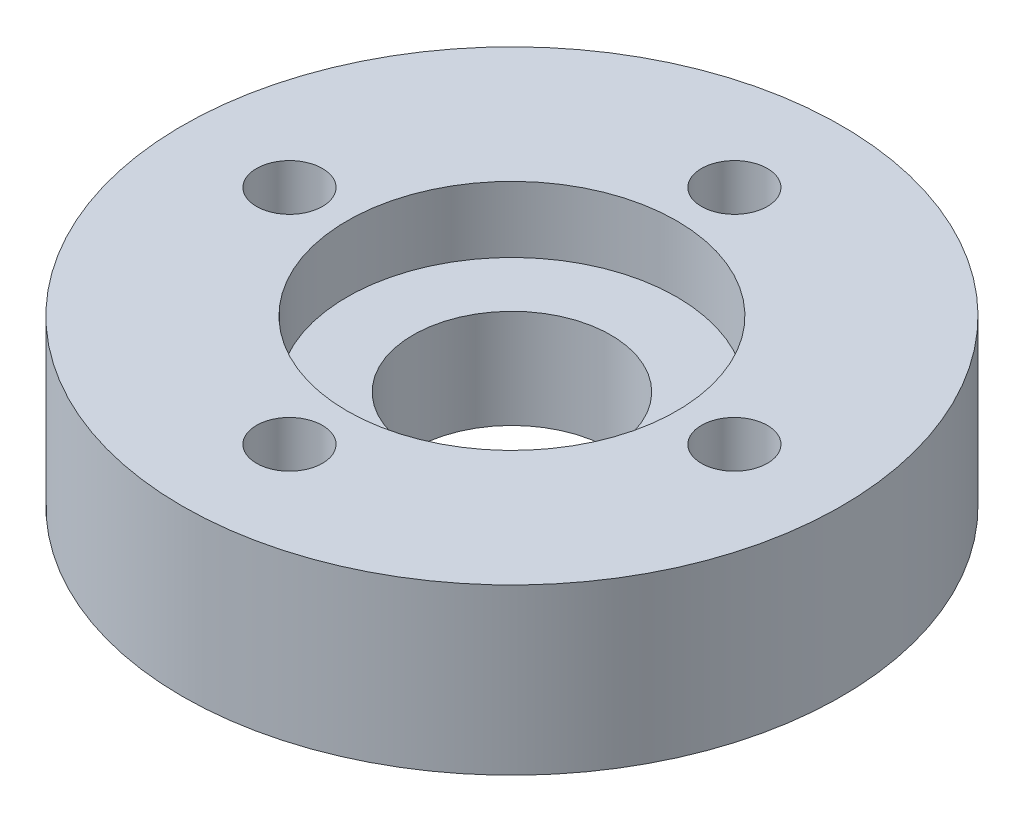
ISO-10303-21;
HEADER;
FILE_DESCRIPTION(('STEP AP214'),'2;1');
FILE_NAME('part.step','',(''),(''),'','','');
FILE_SCHEMA(('AUTOMOTIVE_DESIGN { 1 0 10303 214 1 1 1 1 }'));
ENDSEC;
DATA;
#1=APPLICATION_CONTEXT('core data for automotive mechanical design processes');
#2=APPLICATION_PROTOCOL_DEFINITION('international standard','automotive_design',2000,#1);
#3=PRODUCT_CONTEXT('',#1,'mechanical');
#4=PRODUCT('Part','Part','',(#3));
#5=PRODUCT_RELATED_PRODUCT_CATEGORY('part','',(#4));
#6=PRODUCT_DEFINITION_FORMATION('','',#4);
#7=PRODUCT_DEFINITION_CONTEXT('part definition',#1,'design');
#8=PRODUCT_DEFINITION('design','',#6,#7);
#9=PRODUCT_DEFINITION_SHAPE('','',#8);
#10=(LENGTH_UNIT() NAMED_UNIT(*) SI_UNIT(.MILLI.,.METRE.));
#11=(NAMED_UNIT(*) PLANE_ANGLE_UNIT() SI_UNIT($,.RADIAN.));
#12=(NAMED_UNIT(*) SI_UNIT($,.STERADIAN.) SOLID_ANGLE_UNIT());
#13=UNCERTAINTY_MEASURE_WITH_UNIT(LENGTH_MEASURE(1.E-05),#10,'distance_accuracy_value','');
#14=(GEOMETRIC_REPRESENTATION_CONTEXT(3) GLOBAL_UNCERTAINTY_ASSIGNED_CONTEXT((#13)) GLOBAL_UNIT_ASSIGNED_CONTEXT((#10,
#11,#12)) REPRESENTATION_CONTEXT('',''));
#15=CARTESIAN_POINT('',(0.,0.,0.));
#16=DIRECTION('',(0.,0.,1.));
#17=DIRECTION('',(1.,0.,0.));
#18=AXIS2_PLACEMENT_3D('',#15,#16,#17);
#19=CARTESIAN_POINT('',(-2.43750000000001,5.,4.22187384344915));
#20=DIRECTION('',(0.5,0.,-0.866025403784439));
#21=DIRECTION('',(-0.866025403784439,0.,-0.5));
#22=AXIS2_PLACEMENT_3D('',#19,#20,#21);
#23=PLANE('',#22);
#24=DIRECTION('',(0.,-1.,0.));
#25=VECTOR('',#24,1.);
#26=CARTESIAN_POINT('',(-8.25000000000001,5.,0.866025403784446));
#27=LINE('',#26,#25);
#28=CARTESIAN_POINT('',(-8.25000000000001,3.,0.866025403784446));
#29=VERTEX_POINT('',#28);
#30=CARTESIAN_POINT('',(-8.25000000000001,0.,0.866025403784446));
#31=VERTEX_POINT('',#30);
#32=EDGE_CURVE('E206',#29,#31,#27,.T.);
#33=ORIENTED_EDGE('',*,*,#32,.F.);
#34=DIRECTION('',(0.866025403784439,0.,0.5));
#35=VECTOR('',#34,1.);
#36=CARTESIAN_POINT('',(-2.43750000000001,3.,4.22187384344915));
#37=LINE('',#36,#35);
#38=CARTESIAN_POINT('',(-6.75,3.,1.73205080756889));
#39=VERTEX_POINT('',#38);
#40=EDGE_CURVE('E192',#29,#39,#37,.T.);
#41=ORIENTED_EDGE('',*,*,#40,.T.);
#42=DIRECTION('',(0.,-1.,0.));
#43=VECTOR('',#42,1.);
#44=CARTESIAN_POINT('',(-6.75,5.,1.73205080756889));
#45=LINE('',#44,#43);
#46=CARTESIAN_POINT('',(-6.75,0.,1.73205080756889));
#47=VERTEX_POINT('',#46);
#48=EDGE_CURVE('E261',#39,#47,#45,.T.);
#49=ORIENTED_EDGE('',*,*,#48,.T.);
#50=DIRECTION('',(0.866025403784439,0.,0.5));
#51=VECTOR('',#50,1.);
#52=CARTESIAN_POINT('',(-2.43750000000001,0.,4.22187384344915));
#53=LINE('',#52,#51);
#54=EDGE_CURVE('E212',#31,#47,#53,.T.);
#55=ORIENTED_EDGE('',*,*,#54,.F.);
#56=EDGE_LOOP('',(#33,#41,#49,#55));
#57=FACE_BOUND('',#56,.T.);
#58=ADVANCED_FACE('F33',(#57),#23,.T.);
#59=CARTESIAN_POINT('',(-8.25000000000001,5.,0.));
#60=DIRECTION('',(1.,0.,0.));
#61=DIRECTION('',(0.,0.,-1.));
#62=AXIS2_PLACEMENT_3D('',#59,#60,#61);
#63=PLANE('',#62);
#64=DIRECTION('',(0.,-1.,0.));
#65=VECTOR('',#64,1.);
#66=CARTESIAN_POINT('',(-8.25000000000001,5.,-0.866025403784446));
#67=LINE('',#66,#65);
#68=CARTESIAN_POINT('',(-8.25000000000001,3.,-0.866025403784446));
#69=VERTEX_POINT('',#68);
#70=CARTESIAN_POINT('',(-8.25000000000001,0.,-0.866025403784446));
#71=VERTEX_POINT('',#70);
#72=EDGE_CURVE('E208',#69,#71,#67,.T.);
#73=ORIENTED_EDGE('',*,*,#72,.F.);
#74=DIRECTION('',(0.,0.,1.));
#75=VECTOR('',#74,1.);
#76=CARTESIAN_POINT('',(-8.25000000000001,3.,0.));
#77=LINE('',#76,#75);
#78=EDGE_CURVE('E195',#69,#29,#77,.T.);
#79=ORIENTED_EDGE('',*,*,#78,.T.);
#80=ORIENTED_EDGE('',*,*,#32,.T.);
#81=DIRECTION('',(0.,0.,1.));
#82=VECTOR('',#81,1.);
#83=CARTESIAN_POINT('',(-8.25000000000001,0.,0.));
#84=LINE('',#83,#82);
#85=EDGE_CURVE('E283',#71,#31,#84,.T.);
#86=ORIENTED_EDGE('',*,*,#85,.F.);
#87=EDGE_LOOP('',(#73,#79,#80,#86));
#88=FACE_BOUND('',#87,.T.);
#89=ADVANCED_FACE('F204',(#88),#63,.T.);
#90=CARTESIAN_POINT('',(-2.43750000000001,5.,-4.22187384344915));
#91=DIRECTION('',(0.5,0.,0.866025403784438));
#92=DIRECTION('',(0.866025403784439,0.,-0.5));
#93=AXIS2_PLACEMENT_3D('',#90,#91,#92);
#94=PLANE('',#93);
#95=DIRECTION('',(0.,-1.,0.));
#96=VECTOR('',#95,1.);
#97=CARTESIAN_POINT('',(-6.75,5.,-1.73205080756889));
#98=LINE('',#97,#96);
#99=CARTESIAN_POINT('',(-6.75,3.,-1.73205080756889));
#100=VERTEX_POINT('',#99);
#101=CARTESIAN_POINT('',(-6.75,0.,-1.73205080756889));
#102=VERTEX_POINT('',#101);
#103=EDGE_CURVE('E218',#100,#102,#98,.T.);
#104=ORIENTED_EDGE('',*,*,#103,.F.);
#105=DIRECTION('',(-0.866025403784439,0.,0.5));
#106=VECTOR('',#105,1.);
#107=CARTESIAN_POINT('',(-2.43750000000001,3.,-4.22187384344915));
#108=LINE('',#107,#106);
#109=EDGE_CURVE('E402',#100,#69,#108,.T.);
#110=ORIENTED_EDGE('',*,*,#109,.T.);
#111=ORIENTED_EDGE('',*,*,#72,.T.);
#112=DIRECTION('',(-0.866025403784439,0.,0.5));
#113=VECTOR('',#112,1.);
#114=CARTESIAN_POINT('',(-2.43750000000001,0.,-4.22187384344915));
#115=LINE('',#114,#113);
#116=EDGE_CURVE('E280',#102,#71,#115,.T.);
#117=ORIENTED_EDGE('',*,*,#116,.F.);
#118=EDGE_LOOP('',(#104,#110,#111,#117));
#119=FACE_BOUND('',#118,.T.);
#120=ADVANCED_FACE('F281',(#119),#94,.T.);
#121=CARTESIAN_POINT('',(-0.937499999999994,5.,1.62379763209581));
#122=DIRECTION('',(-0.5,0.,0.866025403784439));
#123=DIRECTION('',(0.866025403784439,0.,0.5));
#124=AXIS2_PLACEMENT_3D('',#121,#122,#123);
#125=PLANE('',#124);
#126=DIRECTION('',(0.,-1.,0.));
#127=VECTOR('',#126,1.);
#128=CARTESIAN_POINT('',(-5.24999999999999,5.,-0.866025403784446));
#129=LINE('',#128,#127);
#130=CARTESIAN_POINT('',(-5.24999999999999,3.,-0.866025403784446));
#131=VERTEX_POINT('',#130);
#132=CARTESIAN_POINT('',(-5.24999999999999,0.,-0.866025403784446));
#133=VERTEX_POINT('',#132);
#134=EDGE_CURVE('E266',#131,#133,#129,.T.);
#135=ORIENTED_EDGE('',*,*,#134,.F.);
#136=DIRECTION('',(-0.866025403784439,0.,-0.5));
#137=VECTOR('',#136,1.);
#138=CARTESIAN_POINT('',(-0.937499999999994,3.,1.62379763209581));
#139=LINE('',#138,#137);
#140=EDGE_CURVE('E277',#131,#100,#139,.T.);
#141=ORIENTED_EDGE('',*,*,#140,.T.);
#142=ORIENTED_EDGE('',*,*,#103,.T.);
#143=DIRECTION('',(-0.866025403784439,0.,-0.5));
#144=VECTOR('',#143,1.);
#145=CARTESIAN_POINT('',(-0.937499999999994,0.,1.62379763209581));
#146=LINE('',#145,#144);
#147=EDGE_CURVE('E275',#133,#102,#146,.T.);
#148=ORIENTED_EDGE('',*,*,#147,.F.);
#149=EDGE_LOOP('',(#135,#141,#142,#148));
#150=FACE_BOUND('',#149,.T.);
#151=ADVANCED_FACE('F273',(#150),#125,.T.);
#152=CARTESIAN_POINT('',(-5.24999999999999,5.,0.));
#153=DIRECTION('',(-1.,0.,0.));
#154=DIRECTION('',(0.,0.,1.));
#155=AXIS2_PLACEMENT_3D('',#152,#153,#154);
#156=PLANE('',#155);
#157=DIRECTION('',(0.,-1.,0.));
#158=VECTOR('',#157,1.);
#159=CARTESIAN_POINT('',(-5.24999999999999,5.,0.866025403784447));
#160=LINE('',#159,#158);
#161=CARTESIAN_POINT('',(-5.24999999999999,3.,0.866025403784447));
#162=VERTEX_POINT('',#161);
#163=CARTESIAN_POINT('',(-5.24999999999999,0.,0.866025403784447));
#164=VERTEX_POINT('',#163);
#165=EDGE_CURVE('E263',#162,#164,#160,.T.);
#166=ORIENTED_EDGE('',*,*,#165,.F.);
#167=DIRECTION('',(0.,0.,-1.));
#168=VECTOR('',#167,1.);
#169=CARTESIAN_POINT('',(-5.24999999999999,3.,0.));
#170=LINE('',#169,#168);
#171=EDGE_CURVE('E48',#162,#131,#170,.T.);
#172=ORIENTED_EDGE('',*,*,#171,.T.);
#173=ORIENTED_EDGE('',*,*,#134,.T.);
#174=DIRECTION('',(0.,0.,-1.));
#175=VECTOR('',#174,1.);
#176=CARTESIAN_POINT('',(-5.24999999999999,0.,0.));
#177=LINE('',#176,#175);
#178=EDGE_CURVE('E289',#164,#133,#177,.T.);
#179=ORIENTED_EDGE('',*,*,#178,.F.);
#180=EDGE_LOOP('',(#166,#172,#173,#179));
#181=FACE_BOUND('',#180,.T.);
#182=ADVANCED_FACE('F400',(#181),#156,.T.);
#183=CARTESIAN_POINT('',(-0.937499999999994,5.,-1.62379763209581));
#184=DIRECTION('',(-0.5,0.,-0.866025403784438));
#185=DIRECTION('',(-0.866025403784439,0.,0.5));
#186=AXIS2_PLACEMENT_3D('',#183,#184,#185);
#187=PLANE('',#186);
#188=ORIENTED_EDGE('',*,*,#48,.F.);
#189=DIRECTION('',(0.866025403784439,0.,-0.5));
#190=VECTOR('',#189,1.);
#191=CARTESIAN_POINT('',(-0.937499999999994,3.,-1.62379763209581));
#192=LINE('',#191,#190);
#193=EDGE_CURVE('E197',#39,#162,#192,.T.);
#194=ORIENTED_EDGE('',*,*,#193,.T.);
#195=ORIENTED_EDGE('',*,*,#165,.T.);
#196=DIRECTION('',(0.866025403784439,0.,-0.5));
#197=VECTOR('',#196,1.);
#198=CARTESIAN_POINT('',(-0.937499999999994,0.,-1.62379763209581));
#199=LINE('',#198,#197);
#200=EDGE_CURVE('E291',#47,#164,#199,.T.);
#201=ORIENTED_EDGE('',*,*,#200,.F.);
#202=EDGE_LOOP('',(#188,#194,#195,#201));
#203=FACE_BOUND('',#202,.T.);
#204=ADVANCED_FACE('F397',(#203),#187,.T.);
#205=CARTESIAN_POINT('',(-1.62379763209582,5.,-0.937499999999998));
#206=DIRECTION('',(-0.866025403784439,0.,-0.5));
#207=DIRECTION('',(-0.5,0.,0.866025403784439));
#208=AXIS2_PLACEMENT_3D('',#205,#206,#207);
#209=PLANE('',#208);
#210=DIRECTION('',(0.,-1.,0.));
#211=VECTOR('',#210,1.);
#212=CARTESIAN_POINT('',(0.86602540378444,5.,-5.25));
#213=LINE('',#212,#211);
#214=CARTESIAN_POINT('',(0.86602540378444,3.,-5.25));
#215=VERTEX_POINT('',#214);
#216=CARTESIAN_POINT('',(0.86602540378444,0.,-5.25));
#217=VERTEX_POINT('',#216);
#218=EDGE_CURVE('E242',#215,#217,#213,.T.);
#219=ORIENTED_EDGE('',*,*,#218,.F.);
#220=DIRECTION('',(0.5,0.,-0.866025403784439));
#221=VECTOR('',#220,1.);
#222=CARTESIAN_POINT('',(-1.62379763209582,3.,-0.937499999999998));
#223=LINE('',#222,#221);
#224=CARTESIAN_POINT('',(1.73205080756888,3.,-6.75));
#225=VERTEX_POINT('',#224);
#226=EDGE_CURVE('E419',#215,#225,#223,.T.);
#227=ORIENTED_EDGE('',*,*,#226,.T.);
#228=DIRECTION('',(0.,-1.,0.));
#229=VECTOR('',#228,1.);
#230=CARTESIAN_POINT('',(1.73205080756888,5.,-6.75));
#231=LINE('',#230,#229);
#232=CARTESIAN_POINT('',(1.73205080756888,0.,-6.75));
#233=VERTEX_POINT('',#232);
#234=EDGE_CURVE('E214',#225,#233,#231,.T.);
#235=ORIENTED_EDGE('',*,*,#234,.T.);
#236=DIRECTION('',(0.5,0.,-0.866025403784439));
#237=VECTOR('',#236,1.);
#238=CARTESIAN_POINT('',(-1.62379763209582,0.,-0.937499999999998));
#239=LINE('',#238,#237);
#240=EDGE_CURVE('E296',#217,#233,#239,.T.);
#241=ORIENTED_EDGE('',*,*,#240,.F.);
#242=EDGE_LOOP('',(#219,#227,#235,#241));
#243=FACE_BOUND('',#242,.T.);
#244=ADVANCED_FACE('F568',(#243),#209,.T.);
#245=CARTESIAN_POINT('',(0.,5.,-5.25));
#246=DIRECTION('',(0.,0.,-1.));
#247=DIRECTION('',(-1.,0.,0.));
#248=AXIS2_PLACEMENT_3D('',#245,#246,#247);
#249=PLANE('',#248);
#250=DIRECTION('',(0.,-1.,0.));
#251=VECTOR('',#250,1.);
#252=CARTESIAN_POINT('',(-0.866025403784438,5.,-5.25));
#253=LINE('',#252,#251);
#254=CARTESIAN_POINT('',(-0.866025403784438,3.,-5.25));
#255=VERTEX_POINT('',#254);
#256=CARTESIAN_POINT('',(-0.866025403784438,0.,-5.25));
#257=VERTEX_POINT('',#256);
#258=EDGE_CURVE('E258',#255,#257,#253,.T.);
#259=ORIENTED_EDGE('',*,*,#258,.F.);
#260=DIRECTION('',(1.,0.,0.));
#261=VECTOR('',#260,1.);
#262=CARTESIAN_POINT('',(0.,3.,-5.25));
#263=LINE('',#262,#261);
#264=EDGE_CURVE('E416',#255,#215,#263,.T.);
#265=ORIENTED_EDGE('',*,*,#264,.T.);
#266=ORIENTED_EDGE('',*,*,#218,.T.);
#267=DIRECTION('',(1.,0.,0.));
#268=VECTOR('',#267,1.);
#269=CARTESIAN_POINT('',(0.,0.,-5.25));
#270=LINE('',#269,#268);
#271=EDGE_CURVE('E299',#257,#217,#270,.T.);
#272=ORIENTED_EDGE('',*,*,#271,.F.);
#273=EDGE_LOOP('',(#259,#265,#266,#272));
#274=FACE_BOUND('',#273,.T.);
#275=ADVANCED_FACE('F564',(#274),#249,.T.);
#276=CARTESIAN_POINT('',(1.62379763209582,5.,-0.937500000000001));
#277=DIRECTION('',(0.866025403784439,0.,-0.5));
#278=DIRECTION('',(-0.5,0.,-0.866025403784439));
#279=AXIS2_PLACEMENT_3D('',#276,#277,#278);
#280=PLANE('',#279);
#281=DIRECTION('',(0.,-1.,0.));
#282=VECTOR('',#281,1.);
#283=CARTESIAN_POINT('',(-1.73205080756888,5.,-6.75));
#284=LINE('',#283,#282);
#285=CARTESIAN_POINT('',(-1.73205080756888,3.,-6.75));
#286=VERTEX_POINT('',#285);
#287=CARTESIAN_POINT('',(-1.73205080756888,0.,-6.75));
#288=VERTEX_POINT('',#287);
#289=EDGE_CURVE('E256',#286,#288,#284,.T.);
#290=ORIENTED_EDGE('',*,*,#289,.F.);
#291=DIRECTION('',(0.5,0.,0.866025403784439));
#292=VECTOR('',#291,1.);
#293=CARTESIAN_POINT('',(1.62379763209582,3.,-0.937500000000001));
#294=LINE('',#293,#292);
#295=EDGE_CURVE('E412',#286,#255,#294,.T.);
#296=ORIENTED_EDGE('',*,*,#295,.T.);
#297=ORIENTED_EDGE('',*,*,#258,.T.);
#298=DIRECTION('',(0.5,0.,0.866025403784439));
#299=VECTOR('',#298,1.);
#300=CARTESIAN_POINT('',(1.62379763209582,0.,-0.937500000000001));
#301=LINE('',#300,#299);
#302=EDGE_CURVE('E302',#288,#257,#301,.T.);
#303=ORIENTED_EDGE('',*,*,#302,.F.);
#304=EDGE_LOOP('',(#290,#296,#297,#303));
#305=FACE_BOUND('',#304,.T.);
#306=ADVANCED_FACE('F560',(#305),#280,.T.);
#307=CARTESIAN_POINT('',(-4.22187384344914,5.,-2.4375));
#308=DIRECTION('',(0.866025403784439,0.,0.5));
#309=DIRECTION('',(0.5,0.,-0.866025403784439));
#310=AXIS2_PLACEMENT_3D('',#307,#308,#309);
#311=PLANE('',#310);
#312=DIRECTION('',(0.,-1.,0.));
#313=VECTOR('',#312,1.);
#314=CARTESIAN_POINT('',(-0.866025403784438,5.,-8.25));
#315=LINE('',#314,#313);
#316=CARTESIAN_POINT('',(-0.866025403784438,3.,-8.25));
#317=VERTEX_POINT('',#316);
#318=CARTESIAN_POINT('',(-0.866025403784438,0.,-8.25));
#319=VERTEX_POINT('',#318);
#320=EDGE_CURVE('E254',#317,#319,#315,.T.);
#321=ORIENTED_EDGE('',*,*,#320,.F.);
#322=DIRECTION('',(-0.5,0.,0.866025403784439));
#323=VECTOR('',#322,1.);
#324=CARTESIAN_POINT('',(-4.22187384344914,3.,-2.4375));
#325=LINE('',#324,#323);
#326=EDGE_CURVE('E425',#317,#286,#325,.T.);
#327=ORIENTED_EDGE('',*,*,#326,.T.);
#328=ORIENTED_EDGE('',*,*,#289,.T.);
#329=DIRECTION('',(-0.5,0.,0.866025403784439));
#330=VECTOR('',#329,1.);
#331=CARTESIAN_POINT('',(-4.22187384344914,0.,-2.4375));
#332=LINE('',#331,#330);
#333=EDGE_CURVE('E305',#319,#288,#332,.T.);
#334=ORIENTED_EDGE('',*,*,#333,.F.);
#335=EDGE_LOOP('',(#321,#327,#328,#334));
#336=FACE_BOUND('',#335,.T.);
#337=ADVANCED_FACE('F556',(#336),#311,.T.);
#338=CARTESIAN_POINT('',(0.,5.,-8.25));
#339=DIRECTION('',(0.,0.,1.));
#340=DIRECTION('',(1.,0.,0.));
#341=AXIS2_PLACEMENT_3D('',#338,#339,#340);
#342=PLANE('',#341);
#343=DIRECTION('',(0.,-1.,0.));
#344=VECTOR('',#343,1.);
#345=CARTESIAN_POINT('',(0.86602540378444,5.,-8.25));
#346=LINE('',#345,#344);
#347=CARTESIAN_POINT('',(0.86602540378444,3.,-8.25));
#348=VERTEX_POINT('',#347);
#349=CARTESIAN_POINT('',(0.86602540378444,0.,-8.25));
#350=VERTEX_POINT('',#349);
#351=EDGE_CURVE('E216',#348,#350,#346,.T.);
#352=ORIENTED_EDGE('',*,*,#351,.F.);
#353=DIRECTION('',(-1.,0.,0.));
#354=VECTOR('',#353,1.);
#355=CARTESIAN_POINT('',(0.,3.,-8.25));
#356=LINE('',#355,#354);
#357=EDGE_CURVE('E56',#348,#317,#356,.T.);
#358=ORIENTED_EDGE('',*,*,#357,.T.);
#359=ORIENTED_EDGE('',*,*,#320,.T.);
#360=DIRECTION('',(-1.,0.,0.));
#361=VECTOR('',#360,1.);
#362=CARTESIAN_POINT('',(0.,0.,-8.25));
#363=LINE('',#362,#361);
#364=EDGE_CURVE('E308',#350,#319,#363,.T.);
#365=ORIENTED_EDGE('',*,*,#364,.F.);
#366=EDGE_LOOP('',(#352,#358,#359,#365));
#367=FACE_BOUND('',#366,.T.);
#368=ADVANCED_FACE('F552',(#367),#342,.T.);
#369=CARTESIAN_POINT('',(4.22187384344914,5.,-2.4375));
#370=DIRECTION('',(-0.866025403784438,0.,0.5));
#371=DIRECTION('',(0.5,0.,0.866025403784438));
#372=AXIS2_PLACEMENT_3D('',#369,#370,#371);
#373=PLANE('',#372);
#374=ORIENTED_EDGE('',*,*,#234,.F.);
#375=DIRECTION('',(-0.5,0.,-0.866025403784439));
#376=VECTOR('',#375,1.);
#377=CARTESIAN_POINT('',(4.22187384344914,3.,-2.4375));
#378=LINE('',#377,#376);
#379=EDGE_CURVE('E422',#225,#348,#378,.T.);
#380=ORIENTED_EDGE('',*,*,#379,.T.);
#381=ORIENTED_EDGE('',*,*,#351,.T.);
#382=DIRECTION('',(-0.5,0.,-0.866025403784439));
#383=VECTOR('',#382,1.);
#384=CARTESIAN_POINT('',(4.22187384344914,0.,-2.4375));
#385=LINE('',#384,#383);
#386=EDGE_CURVE('E311',#233,#350,#385,.T.);
#387=ORIENTED_EDGE('',*,*,#386,.F.);
#388=EDGE_LOOP('',(#374,#380,#381,#387));
#389=FACE_BOUND('',#388,.T.);
#390=ADVANCED_FACE('F548',(#389),#373,.T.);
#391=CARTESIAN_POINT('',(3.88526708448991,5.,4.36980930651859));
#392=DIRECTION('',(-0.664458618437066,0.,-0.747325059384941));
#393=DIRECTION('',(-0.747325059384941,0.,0.664458618437066));
#394=AXIS2_PLACEMENT_3D('',#391,#392,#393);
#395=PLANE('',#394);
#396=DIRECTION('',(0.,-1.,0.));
#397=VECTOR('',#396,1.);
#398=CARTESIAN_POINT('',(7.06737274422862,5.,1.54054845966445));
#399=LINE('',#398,#397);
#400=CARTESIAN_POINT('',(7.06737274422862,3.,1.54054845966445));
#401=VERTEX_POINT('',#400);
#402=CARTESIAN_POINT('',(7.06737274422862,0.,1.54054845966445));
#403=VERTEX_POINT('',#402);
#404=EDGE_CURVE('E250',#401,#403,#399,.T.);
#405=ORIENTED_EDGE('',*,*,#404,.F.);
#406=DIRECTION('',(0.747325059384941,0.,-0.664458618437066));
#407=VECTOR('',#406,1.);
#408=CARTESIAN_POINT('',(3.88526708448991,3.,4.36980930651859));
#409=LINE('',#408,#407);
#410=CARTESIAN_POINT('',(8.24284047394471,3.,0.495421370861457));
#411=VERTEX_POINT('',#410);
#412=EDGE_CURVE('E440',#401,#411,#409,.T.);
#413=ORIENTED_EDGE('',*,*,#412,.T.);
#414=DIRECTION('',(0.,-1.,0.));
#415=VECTOR('',#414,1.);
#416=CARTESIAN_POINT('',(8.24284047394471,5.,0.495421370861457));
#417=LINE('',#416,#415);
#418=CARTESIAN_POINT('',(8.24284047394471,0.,0.495421370861457));
#419=VERTEX_POINT('',#418);
#420=EDGE_CURVE('E239',#411,#419,#417,.T.);
#421=ORIENTED_EDGE('',*,*,#420,.T.);
#422=DIRECTION('',(0.747325059384941,0.,-0.664458618437066));
#423=VECTOR('',#422,1.);
#424=CARTESIAN_POINT('',(3.88526708448991,0.,4.36980930651859));
#425=LINE('',#424,#423);
#426=EDGE_CURVE('E314',#403,#419,#425,.T.);
#427=ORIENTED_EDGE('',*,*,#426,.F.);
#428=EDGE_LOOP('',(#405,#413,#421,#427));
#429=FACE_BOUND('',#428,.T.);
#430=ADVANCED_FACE('F544',(#429),#395,.T.);
#431=CARTESIAN_POINT('',(0.240607197702958,5.,-0.725015480113064));
#432=DIRECTION('',(0.314973177093541,0.,-0.949100573022481));
#433=DIRECTION('',(-0.949100573022481,0.,-0.314973177093541));
#434=AXIS2_PLACEMENT_3D('',#431,#432,#433);
#435=PLANE('',#434);
#436=DIRECTION('',(0.,-1.,0.));
#437=VECTOR('',#436,1.);
#438=CARTESIAN_POINT('',(5.57453227028391,5.,1.04512708880299));
#439=LINE('',#438,#437);
#440=CARTESIAN_POINT('',(5.57453227028391,3.,1.04512708880299));
#441=VERTEX_POINT('',#440);
#442=CARTESIAN_POINT('',(5.57453227028391,0.,1.04512708880299));
#443=VERTEX_POINT('',#442);
#444=EDGE_CURVE('E248',#441,#443,#439,.T.);
#445=ORIENTED_EDGE('',*,*,#444,.F.);
#446=DIRECTION('',(0.949100573022481,0.,0.314973177093541));
#447=VECTOR('',#446,1.);
#448=CARTESIAN_POINT('',(0.240607197702958,3.,-0.725015480113064));
#449=LINE('',#448,#447);
#450=EDGE_CURVE('E437',#441,#401,#449,.T.);
#451=ORIENTED_EDGE('',*,*,#450,.T.);
#452=ORIENTED_EDGE('',*,*,#404,.T.);
#453=DIRECTION('',(0.949100573022481,0.,0.314973177093541));
#454=VECTOR('',#453,1.);
#455=CARTESIAN_POINT('',(0.240607197702958,0.,-0.725015480113064));
#456=LINE('',#455,#454);
#457=EDGE_CURVE('E317',#443,#403,#456,.T.);
#458=ORIENTED_EDGE('',*,*,#457,.F.);
#459=EDGE_LOOP('',(#445,#451,#452,#458));
#460=FACE_BOUND('',#459,.T.);
#461=ADVANCED_FACE('F540',(#460),#435,.T.);
#462=CARTESIAN_POINT('',(5.14103073231967,5.,-1.05911827793808));
#463=DIRECTION('',(0.979431795530606,0.,-0.20177551363754));
#464=DIRECTION('',(-0.20177551363754,0.,-0.979431795530606));
#465=AXIS2_PLACEMENT_3D('',#462,#463,#464);
#466=PLANE('',#465);
#467=DIRECTION('',(0.,-1.,0.));
#468=VECTOR('',#467,1.);
#469=CARTESIAN_POINT('',(5.25715952605529,5.,-0.495421370861457));
#470=LINE('',#469,#468);
#471=CARTESIAN_POINT('',(5.25715952605529,3.,-0.495421370861457));
#472=VERTEX_POINT('',#471);
#473=CARTESIAN_POINT('',(5.25715952605529,0.,-0.495421370861457));
#474=VERTEX_POINT('',#473);
#475=EDGE_CURVE('E246',#472,#474,#470,.T.);
#476=ORIENTED_EDGE('',*,*,#475,.F.);
#477=DIRECTION('',(0.20177551363754,0.,0.979431795530606));
#478=VECTOR('',#477,1.);
#479=CARTESIAN_POINT('',(5.14103073231967,3.,-1.05911827793808));
#480=LINE('',#479,#478);
#481=EDGE_CURVE('E434',#472,#441,#480,.T.);
#482=ORIENTED_EDGE('',*,*,#481,.T.);
#483=ORIENTED_EDGE('',*,*,#444,.T.);
#484=DIRECTION('',(0.20177551363754,0.,0.979431795530606));
#485=VECTOR('',#484,1.);
#486=CARTESIAN_POINT('',(5.14103073231967,0.,-1.05911827793808));
#487=LINE('',#486,#485);
#488=EDGE_CURVE('E320',#474,#443,#487,.T.);
#489=ORIENTED_EDGE('',*,*,#488,.F.);
#490=EDGE_LOOP('',(#476,#482,#483,#489));
#491=FACE_BOUND('',#490,.T.);
#492=ADVANCED_FACE('F536',(#491),#466,.T.);
#493=CARTESIAN_POINT('',(2.07505386631657,5.,2.33383947599268));
#494=DIRECTION('',(0.664458618437066,0.,0.747325059384941));
#495=DIRECTION('',(0.747325059384941,0.,-0.664458618437066));
#496=AXIS2_PLACEMENT_3D('',#493,#494,#495);
#497=PLANE('',#496);
#498=DIRECTION('',(0.,-1.,0.));
#499=VECTOR('',#498,1.);
#500=CARTESIAN_POINT('',(6.43262725577138,5.,-1.54054845966445));
#501=LINE('',#500,#499);
#502=CARTESIAN_POINT('',(6.43262725577138,3.,-1.54054845966445));
#503=VERTEX_POINT('',#502);
#504=CARTESIAN_POINT('',(6.43262725577138,0.,-1.54054845966445));
#505=VERTEX_POINT('',#504);
#506=EDGE_CURVE('E244',#503,#505,#501,.T.);
#507=ORIENTED_EDGE('',*,*,#506,.F.);
#508=DIRECTION('',(-0.747325059384941,0.,0.664458618437066));
#509=VECTOR('',#508,1.);
#510=CARTESIAN_POINT('',(2.07505386631657,3.,2.33383947599268));
#511=LINE('',#510,#509);
#512=EDGE_CURVE('E449',#503,#472,#511,.T.);
#513=ORIENTED_EDGE('',*,*,#512,.T.);
#514=ORIENTED_EDGE('',*,*,#475,.T.);
#515=DIRECTION('',(-0.747325059384941,0.,0.664458618437066));
#516=VECTOR('',#515,1.);
#517=CARTESIAN_POINT('',(2.07505386631657,0.,2.33383947599268));
#518=LINE('',#517,#516);
#519=EDGE_CURVE('E323',#505,#474,#518,.T.);
#520=ORIENTED_EDGE('',*,*,#519,.F.);
#521=EDGE_LOOP('',(#507,#513,#514,#520));
#522=FACE_BOUND('',#521,.T.);
#523=ADVANCED_FACE('F532',(#522),#497,.T.);
#524=CARTESIAN_POINT('',(1.09870218319043,5.,-3.31069102858051));
#525=DIRECTION('',(-0.314973177093541,0.,0.949100573022481));
#526=DIRECTION('',(0.949100573022481,0.,0.314973177093541));
#527=AXIS2_PLACEMENT_3D('',#524,#525,#526);
#528=PLANE('',#527);
#529=DIRECTION('',(0.,-1.,0.));
#530=VECTOR('',#529,1.);
#531=CARTESIAN_POINT('',(7.92546772971609,5.,-1.04512708880299));
#532=LINE('',#531,#530);
#533=CARTESIAN_POINT('',(7.92546772971609,3.,-1.04512708880299));
#534=VERTEX_POINT('',#533);
#535=CARTESIAN_POINT('',(7.92546772971609,0.,-1.04512708880299));
#536=VERTEX_POINT('',#535);
#537=EDGE_CURVE('E241',#534,#536,#532,.T.);
#538=ORIENTED_EDGE('',*,*,#537,.F.);
#539=DIRECTION('',(-0.949100573022481,0.,-0.314973177093541));
#540=VECTOR('',#539,1.);
#541=CARTESIAN_POINT('',(1.09870218319043,3.,-3.31069102858051));
#542=LINE('',#541,#540);
#543=EDGE_CURVE('E446',#534,#503,#542,.T.);
#544=ORIENTED_EDGE('',*,*,#543,.T.);
#545=ORIENTED_EDGE('',*,*,#506,.T.);
#546=DIRECTION('',(-0.949100573022481,0.,-0.314973177093541));
#547=VECTOR('',#546,1.);
#548=CARTESIAN_POINT('',(1.09870218319043,0.,-3.31069102858051));
#549=LINE('',#548,#547);
#550=EDGE_CURVE('E326',#536,#505,#549,.T.);
#551=ORIENTED_EDGE('',*,*,#550,.F.);
#552=EDGE_LOOP('',(#538,#544,#545,#551));
#553=FACE_BOUND('',#552,.T.);
#554=ADVANCED_FACE('F528',(#553),#528,.T.);
#555=CARTESIAN_POINT('',(7.80933893598048,5.,-1.60882399587962));
#556=DIRECTION('',(-0.979431795530606,0.,0.20177551363754));
#557=DIRECTION('',(0.20177551363754,0.,0.979431795530606));
#558=AXIS2_PLACEMENT_3D('',#555,#556,#557);
#559=PLANE('',#558);
#560=ORIENTED_EDGE('',*,*,#420,.F.);
#561=DIRECTION('',(-0.20177551363754,0.,-0.979431795530606));
#562=VECTOR('',#561,1.);
#563=CARTESIAN_POINT('',(7.80933893598048,3.,-1.60882399587962));
#564=LINE('',#563,#562);
#565=EDGE_CURVE('E443',#411,#534,#564,.T.);
#566=ORIENTED_EDGE('',*,*,#565,.T.);
#567=ORIENTED_EDGE('',*,*,#537,.T.);
#568=DIRECTION('',(-0.20177551363754,0.,-0.979431795530606));
#569=VECTOR('',#568,1.);
#570=CARTESIAN_POINT('',(7.80933893598048,0.,-1.60882399587962));
#571=LINE('',#570,#569);
#572=EDGE_CURVE('E329',#419,#536,#571,.T.);
#573=ORIENTED_EDGE('',*,*,#572,.F.);
#574=EDGE_LOOP('',(#560,#566,#567,#573));
#575=FACE_BOUND('',#574,.T.);
#576=ADVANCED_FACE('F525',(#575),#559,.T.);
#577=CARTESIAN_POINT('',(4.22187384344914,5.,2.4375));
#578=DIRECTION('',(-0.866025403784439,0.,-0.5));
#579=DIRECTION('',(-0.5,0.,0.866025403784439));
#580=AXIS2_PLACEMENT_3D('',#577,#578,#579);
#581=PLANE('',#580);
#582=DIRECTION('',(0.,-1.,0.));
#583=VECTOR('',#582,1.);
#584=CARTESIAN_POINT('',(0.866025403784439,5.,8.25));
#585=LINE('',#584,#583);
#586=CARTESIAN_POINT('',(0.866025403784439,3.,8.25));
#587=VERTEX_POINT('',#586);
#588=CARTESIAN_POINT('',(0.866025403784439,0.,8.25));
#589=VERTEX_POINT('',#588);
#590=EDGE_CURVE('E224',#587,#589,#585,.T.);
#591=ORIENTED_EDGE('',*,*,#590,.F.);
#592=DIRECTION('',(0.5,0.,-0.866025403784439));
#593=VECTOR('',#592,1.);
#594=CARTESIAN_POINT('',(4.22187384344914,3.,2.4375));
#595=LINE('',#594,#593);
#596=CARTESIAN_POINT('',(1.73205080756888,3.,6.75));
#597=VERTEX_POINT('',#596);
#598=EDGE_CURVE('E385',#587,#597,#595,.T.);
#599=ORIENTED_EDGE('',*,*,#598,.T.);
#600=DIRECTION('',(0.,-1.,0.));
#601=VECTOR('',#600,1.);
#602=CARTESIAN_POINT('',(1.73205080756888,5.,6.75));
#603=LINE('',#602,#601);
#604=CARTESIAN_POINT('',(1.73205080756888,0.,6.75));
#605=VERTEX_POINT('',#604);
#606=EDGE_CURVE('E251',#597,#605,#603,.T.);
#607=ORIENTED_EDGE('',*,*,#606,.T.);
#608=DIRECTION('',(0.5,0.,-0.866025403784439));
#609=VECTOR('',#608,1.);
#610=CARTESIAN_POINT('',(4.22187384344914,0.,2.4375));
#611=LINE('',#610,#609);
#612=EDGE_CURVE('E332',#589,#605,#611,.T.);
#613=ORIENTED_EDGE('',*,*,#612,.F.);
#614=EDGE_LOOP('',(#591,#599,#607,#613));
#615=FACE_BOUND('',#614,.T.);
#616=ADVANCED_FACE('F462',(#615),#581,.T.);
#617=CARTESIAN_POINT('',(0.,5.,8.25));
#618=DIRECTION('',(0.,0.,-1.));
#619=DIRECTION('',(-1.,0.,0.));
#620=AXIS2_PLACEMENT_3D('',#617,#618,#619);
#621=PLANE('',#620);
#622=DIRECTION('',(0.,-1.,0.));
#623=VECTOR('',#622,1.);
#624=CARTESIAN_POINT('',(-0.866025403784439,5.,8.25));
#625=LINE('',#624,#623);
#626=CARTESIAN_POINT('',(-0.866025403784439,3.,8.25));
#627=VERTEX_POINT('',#626);
#628=CARTESIAN_POINT('',(-0.866025403784439,0.,8.25));
#629=VERTEX_POINT('',#628);
#630=EDGE_CURVE('E228',#627,#629,#625,.T.);
#631=ORIENTED_EDGE('',*,*,#630,.F.);
#632=DIRECTION('',(1.,0.,0.));
#633=VECTOR('',#632,1.);
#634=CARTESIAN_POINT('',(0.,3.,8.25));
#635=LINE('',#634,#633);
#636=EDGE_CURVE('E458',#627,#587,#635,.T.);
#637=ORIENTED_EDGE('',*,*,#636,.T.);
#638=ORIENTED_EDGE('',*,*,#590,.T.);
#639=DIRECTION('',(1.,0.,0.));
#640=VECTOR('',#639,1.);
#641=CARTESIAN_POINT('',(0.,0.,8.25));
#642=LINE('',#641,#640);
#643=EDGE_CURVE('E335',#629,#589,#642,.T.);
#644=ORIENTED_EDGE('',*,*,#643,.F.);
#645=EDGE_LOOP('',(#631,#637,#638,#644));
#646=FACE_BOUND('',#645,.T.);
#647=ADVANCED_FACE('F520',(#646),#621,.T.);
#648=CARTESIAN_POINT('',(-4.22187384344914,5.,2.4375));
#649=DIRECTION('',(0.866025403784439,0.,-0.5));
#650=DIRECTION('',(-0.5,0.,-0.866025403784439));
#651=AXIS2_PLACEMENT_3D('',#648,#649,#650);
#652=PLANE('',#651);
#653=DIRECTION('',(0.,-1.,0.));
#654=VECTOR('',#653,1.);
#655=CARTESIAN_POINT('',(-1.73205080756888,5.,6.75));
#656=LINE('',#655,#654);
#657=CARTESIAN_POINT('',(-1.73205080756888,3.,6.75));
#658=VERTEX_POINT('',#657);
#659=CARTESIAN_POINT('',(-1.73205080756888,0.,6.75));
#660=VERTEX_POINT('',#659);
#661=EDGE_CURVE('E235',#658,#660,#656,.T.);
#662=ORIENTED_EDGE('',*,*,#661,.F.);
#663=DIRECTION('',(0.5,0.,0.866025403784439));
#664=VECTOR('',#663,1.);
#665=CARTESIAN_POINT('',(-4.22187384344914,3.,2.4375));
#666=LINE('',#665,#664);
#667=EDGE_CURVE('E383',#658,#627,#666,.T.);
#668=ORIENTED_EDGE('',*,*,#667,.T.);
#669=ORIENTED_EDGE('',*,*,#630,.T.);
#670=DIRECTION('',(0.5,0.,0.866025403784439));
#671=VECTOR('',#670,1.);
#672=CARTESIAN_POINT('',(-4.22187384344914,0.,2.4375));
#673=LINE('',#672,#671);
#674=EDGE_CURVE('E338',#660,#629,#673,.T.);
#675=ORIENTED_EDGE('',*,*,#674,.F.);
#676=EDGE_LOOP('',(#662,#668,#669,#675));
#677=FACE_BOUND('',#676,.T.);
#678=ADVANCED_FACE('F368',(#677),#652,.T.);
#679=CARTESIAN_POINT('',(1.62379763209582,5.,0.937499999999998));
#680=DIRECTION('',(0.866025403784439,0.,0.5));
#681=DIRECTION('',(0.5,0.,-0.866025403784439));
#682=AXIS2_PLACEMENT_3D('',#679,#680,#681);
#683=PLANE('',#682);
#684=DIRECTION('',(0.,-1.,0.));
#685=VECTOR('',#684,1.);
#686=CARTESIAN_POINT('',(-0.866025403784439,5.,5.25));
#687=LINE('',#686,#685);
#688=CARTESIAN_POINT('',(-0.866025403784439,3.,5.25));
#689=VERTEX_POINT('',#688);
#690=CARTESIAN_POINT('',(-0.866025403784439,0.,5.25));
#691=VERTEX_POINT('',#690);
#692=EDGE_CURVE('E357',#689,#691,#687,.T.);
#693=ORIENTED_EDGE('',*,*,#692,.F.);
#694=DIRECTION('',(-0.5,0.,0.866025403784439));
#695=VECTOR('',#694,1.);
#696=CARTESIAN_POINT('',(1.62379763209582,3.,0.937499999999998));
#697=LINE('',#696,#695);
#698=EDGE_CURVE('E365',#689,#658,#697,.T.);
#699=ORIENTED_EDGE('',*,*,#698,.T.);
#700=ORIENTED_EDGE('',*,*,#661,.T.);
#701=DIRECTION('',(-0.5,0.,0.866025403784439));
#702=VECTOR('',#701,1.);
#703=CARTESIAN_POINT('',(1.62379763209582,0.,0.937499999999998));
#704=LINE('',#703,#702);
#705=EDGE_CURVE('E341',#691,#660,#704,.T.);
#706=ORIENTED_EDGE('',*,*,#705,.F.);
#707=EDGE_LOOP('',(#693,#699,#700,#706));
#708=FACE_BOUND('',#707,.T.);
#709=ADVANCED_FACE('F364',(#708),#683,.T.);
#710=CARTESIAN_POINT('',(0.,5.,5.25));
#711=DIRECTION('',(0.,0.,1.));
#712=DIRECTION('',(1.,0.,0.));
#713=AXIS2_PLACEMENT_3D('',#710,#711,#712);
#714=PLANE('',#713);
#715=DIRECTION('',(0.,-1.,0.));
#716=VECTOR('',#715,1.);
#717=CARTESIAN_POINT('',(0.866025403784439,5.,5.25));
#718=LINE('',#717,#716);
#719=CARTESIAN_POINT('',(0.866025403784439,3.,5.25));
#720=VERTEX_POINT('',#719);
#721=CARTESIAN_POINT('',(0.866025403784439,0.,5.25));
#722=VERTEX_POINT('',#721);
#723=EDGE_CURVE('E355',#720,#722,#718,.T.);
#724=ORIENTED_EDGE('',*,*,#723,.F.);
#725=DIRECTION('',(-1.,0.,0.));
#726=VECTOR('',#725,1.);
#727=CARTESIAN_POINT('',(0.,3.,5.25));
#728=LINE('',#727,#726);
#729=EDGE_CURVE('E378',#720,#689,#728,.T.);
#730=ORIENTED_EDGE('',*,*,#729,.T.);
#731=ORIENTED_EDGE('',*,*,#692,.T.);
#732=DIRECTION('',(-1.,0.,0.));
#733=VECTOR('',#732,1.);
#734=CARTESIAN_POINT('',(0.,0.,5.25));
#735=LINE('',#734,#733);
#736=EDGE_CURVE('E344',#722,#691,#735,.T.);
#737=ORIENTED_EDGE('',*,*,#736,.F.);
#738=EDGE_LOOP('',(#724,#730,#731,#737));
#739=FACE_BOUND('',#738,.T.);
#740=ADVANCED_FACE('F376',(#739),#714,.T.);
#741=CARTESIAN_POINT('',(-1.62379763209582,5.,0.9375));
#742=DIRECTION('',(-0.866025403784439,0.,0.5));
#743=DIRECTION('',(0.5,0.,0.866025403784439));
#744=AXIS2_PLACEMENT_3D('',#741,#742,#743);
#745=PLANE('',#744);
#746=ORIENTED_EDGE('',*,*,#606,.F.);
#747=DIRECTION('',(-0.5,0.,-0.866025403784439));
#748=VECTOR('',#747,1.);
#749=CARTESIAN_POINT('',(-1.62379763209582,3.,0.9375));
#750=LINE('',#749,#748);
#751=EDGE_CURVE('E381',#597,#720,#750,.T.);
#752=ORIENTED_EDGE('',*,*,#751,.T.);
#753=ORIENTED_EDGE('',*,*,#723,.T.);
#754=DIRECTION('',(-0.5,0.,-0.866025403784439));
#755=VECTOR('',#754,1.);
#756=CARTESIAN_POINT('',(-1.62379763209582,0.,0.9375));
#757=LINE('',#756,#755);
#758=EDGE_CURVE('E347',#605,#722,#757,.T.);
#759=ORIENTED_EDGE('',*,*,#758,.F.);
#760=EDGE_LOOP('',(#746,#752,#753,#759));
#761=FACE_BOUND('',#760,.T.);
#762=ADVANCED_FACE('F464',(#761),#745,.T.);
#763=CARTESIAN_POINT('',(0.,3.,0.));
#764=DIRECTION('',(0.,-1.,0.));
#765=DIRECTION('',(0.,0.,-1.));
#766=AXIS2_PLACEMENT_3D('',#763,#764,#765);
#767=CYLINDRICAL_SURFACE('',#766,3.);
#768=CARTESIAN_POINT('',(0.,3.,0.));
#769=DIRECTION('',(0.,1.,0.));
#770=DIRECTION('',(0.,0.,1.));
#771=AXIS2_PLACEMENT_3D('',#768,#769,#770);
#772=CIRCLE('',#771,3.);
#773=CARTESIAN_POINT('',(0.,3.,3.));
#774=VERTEX_POINT('',#773);
#775=EDGE_CURVE('E11',#774,#774,#772,.T.);
#776=ORIENTED_EDGE('',*,*,#775,.T.);
#777=EDGE_LOOP('',(#776));
#778=FACE_BOUND('',#777,.T.);
#779=CARTESIAN_POINT('',(0.,0.,0.));
#780=DIRECTION('',(0.,1.,0.));
#781=DIRECTION('',(0.,0.,1.));
#782=AXIS2_PLACEMENT_3D('',#779,#780,#781);
#783=CIRCLE('',#782,3.);
#784=CARTESIAN_POINT('',(0.,0.,3.));
#785=VERTEX_POINT('',#784);
#786=EDGE_CURVE('E37',#785,#785,#783,.T.);
#787=ORIENTED_EDGE('',*,*,#786,.F.);
#788=EDGE_LOOP('',(#787));
#789=FACE_BOUND('',#788,.T.);
#790=ADVANCED_FACE('F35',(#778,#789),#767,.F.);
#791=CARTESIAN_POINT('',(0.,3.,0.));
#792=DIRECTION('',(0.,1.,0.));
#793=DIRECTION('',(0.,0.,1.));
#794=AXIS2_PLACEMENT_3D('',#791,#792,#793);
#795=PLANE('',#794);
#796=ORIENTED_EDGE('',*,*,#775,.F.);
#797=EDGE_LOOP('',(#796));
#798=FACE_BOUND('',#797,.T.);
#799=CARTESIAN_POINT('',(0.,3.,0.));
#800=DIRECTION('',(0.,1.,0.));
#801=DIRECTION('',(0.,0.,1.));
#802=AXIS2_PLACEMENT_3D('',#799,#800,#801);
#803=CIRCLE('',#802,5.);
#804=CARTESIAN_POINT('',(0.,3.,5.));
#805=VERTEX_POINT('',#804);
#806=EDGE_CURVE('E222',#805,#805,#803,.F.);
#807=ORIENTED_EDGE('',*,*,#806,.F.);
#808=EDGE_LOOP('',(#807));
#809=FACE_BOUND('',#808,.T.);
#810=ADVANCED_FACE('F489',(#798,#809),#795,.T.);
#811=CARTESIAN_POINT('',(0.,0.,0.));
#812=DIRECTION('',(0.,1.,0.));
#813=DIRECTION('',(0.,0.,1.));
#814=AXIS2_PLACEMENT_3D('',#811,#812,#813);
#815=PLANE('',#814);
#816=ORIENTED_EDGE('',*,*,#786,.T.);
#817=EDGE_LOOP('',(#816));
#818=FACE_BOUND('',#817,.T.);
#819=ORIENTED_EDGE('',*,*,#54,.T.);
#820=ORIENTED_EDGE('',*,*,#200,.T.);
#821=ORIENTED_EDGE('',*,*,#178,.T.);
#822=ORIENTED_EDGE('',*,*,#147,.T.);
#823=ORIENTED_EDGE('',*,*,#116,.T.);
#824=ORIENTED_EDGE('',*,*,#85,.T.);
#825=EDGE_LOOP('',(#819,#820,#821,#822,#823,#824));
#826=FACE_BOUND('',#825,.T.);
#827=ORIENTED_EDGE('',*,*,#240,.T.);
#828=ORIENTED_EDGE('',*,*,#386,.T.);
#829=ORIENTED_EDGE('',*,*,#364,.T.);
#830=ORIENTED_EDGE('',*,*,#333,.T.);
#831=ORIENTED_EDGE('',*,*,#302,.T.);
#832=ORIENTED_EDGE('',*,*,#271,.T.);
#833=EDGE_LOOP('',(#827,#828,#829,#830,#831,#832));
#834=FACE_BOUND('',#833,.T.);
#835=ORIENTED_EDGE('',*,*,#426,.T.);
#836=ORIENTED_EDGE('',*,*,#572,.T.);
#837=ORIENTED_EDGE('',*,*,#550,.T.);
#838=ORIENTED_EDGE('',*,*,#519,.T.);
#839=ORIENTED_EDGE('',*,*,#488,.T.);
#840=ORIENTED_EDGE('',*,*,#457,.T.);
#841=EDGE_LOOP('',(#835,#836,#837,#838,#839,#840));
#842=FACE_BOUND('',#841,.T.);
#843=ORIENTED_EDGE('',*,*,#612,.T.);
#844=ORIENTED_EDGE('',*,*,#758,.T.);
#845=ORIENTED_EDGE('',*,*,#736,.T.);
#846=ORIENTED_EDGE('',*,*,#705,.T.);
#847=ORIENTED_EDGE('',*,*,#674,.T.);
#848=ORIENTED_EDGE('',*,*,#643,.T.);
#849=EDGE_LOOP('',(#843,#844,#845,#846,#847,#848));
#850=FACE_BOUND('',#849,.T.);
#851=CARTESIAN_POINT('',(0.,0.,0.));
#852=DIRECTION('',(0.,1.,0.));
#853=DIRECTION('',(0.,0.,1.));
#854=AXIS2_PLACEMENT_3D('',#851,#852,#853);
#855=CIRCLE('',#854,10.);
#856=CARTESIAN_POINT('',(0.,0.,10.));
#857=VERTEX_POINT('',#856);
#858=EDGE_CURVE('E350',#857,#857,#855,.T.);
#859=ORIENTED_EDGE('',*,*,#858,.F.);
#860=EDGE_LOOP('',(#859));
#861=FACE_BOUND('',#860,.T.);
#862=ADVANCED_FACE('F285',(#818,#826,#834,#842,#850,#861),#815,.F.);
#863=CARTESIAN_POINT('',(0.,5.,0.));
#864=DIRECTION('',(0.,-1.,0.));
#865=DIRECTION('',(0.,0.,-1.));
#866=AXIS2_PLACEMENT_3D('',#863,#864,#865);
#867=CYLINDRICAL_SURFACE('',#866,5.);
#868=ORIENTED_EDGE('',*,*,#806,.T.);
#869=EDGE_LOOP('',(#868));
#870=FACE_BOUND('',#869,.T.);
#871=CARTESIAN_POINT('',(0.,5.,0.));
#872=DIRECTION('',(0.,1.,0.));
#873=DIRECTION('',(0.,0.,1.));
#874=AXIS2_PLACEMENT_3D('',#871,#872,#873);
#875=CIRCLE('',#874,5.);
#876=CARTESIAN_POINT('',(0.,5.,5.));
#877=VERTEX_POINT('',#876);
#878=EDGE_CURVE('E353',#877,#877,#875,.T.);
#879=ORIENTED_EDGE('',*,*,#878,.T.);
#880=EDGE_LOOP('',(#879));
#881=FACE_BOUND('',#880,.T.);
#882=ADVANCED_FACE('F493',(#870,#881),#867,.F.);
#883=CARTESIAN_POINT('',(0.,5.,0.));
#884=DIRECTION('',(0.,-1.,0.));
#885=DIRECTION('',(0.,0.,-1.));
#886=AXIS2_PLACEMENT_3D('',#883,#884,#885);
#887=CYLINDRICAL_SURFACE('',#886,10.);
#888=CARTESIAN_POINT('',(0.,5.,0.));
#889=DIRECTION('',(0.,1.,0.));
#890=DIRECTION('',(0.,0.,1.));
#891=AXIS2_PLACEMENT_3D('',#888,#889,#890);
#892=CIRCLE('',#891,10.);
#893=CARTESIAN_POINT('',(0.,5.,10.));
#894=VERTEX_POINT('',#893);
#895=EDGE_CURVE('E264',#894,#894,#892,.T.);
#896=ORIENTED_EDGE('',*,*,#895,.F.);
#897=EDGE_LOOP('',(#896));
#898=FACE_BOUND('',#897,.T.);
#899=ORIENTED_EDGE('',*,*,#858,.T.);
#900=EDGE_LOOP('',(#899));
#901=FACE_BOUND('',#900,.T.);
#902=ADVANCED_FACE('F498',(#898,#901),#887,.T.);
#903=CARTESIAN_POINT('',(0.,5.,0.));
#904=DIRECTION('',(0.,1.,0.));
#905=DIRECTION('',(0.,0.,1.));
#906=AXIS2_PLACEMENT_3D('',#903,#904,#905);
#907=PLANE('',#906);
#908=ORIENTED_EDGE('',*,*,#878,.F.);
#909=EDGE_LOOP('',(#908));
#910=FACE_BOUND('',#909,.T.);
#911=ORIENTED_EDGE('',*,*,#895,.T.);
#912=EDGE_LOOP('',(#911));
#913=FACE_BOUND('',#912,.T.);
#914=CARTESIAN_POINT('',(0.,5.,6.75));
#915=DIRECTION('',(0.,1.,0.));
#916=DIRECTION('',(0.,0.,1.));
#917=AXIS2_PLACEMENT_3D('',#914,#915,#916);
#918=CIRCLE('',#917,1.);
#919=CARTESIAN_POINT('',(0.,5.,7.75));
#920=VERTEX_POINT('',#919);
#921=EDGE_CURVE('E390',#920,#920,#918,.T.);
#922=ORIENTED_EDGE('',*,*,#921,.F.);
#923=EDGE_LOOP('',(#922));
#924=FACE_BOUND('',#923,.T.);
#925=CARTESIAN_POINT('',(6.75,5.,0.));
#926=DIRECTION('',(0.,1.,0.));
#927=DIRECTION('',(0.,0.,1.));
#928=AXIS2_PLACEMENT_3D('',#925,#926,#927);
#929=CIRCLE('',#928,1.);
#930=CARTESIAN_POINT('',(6.75,5.,1.));
#931=VERTEX_POINT('',#930);
#932=EDGE_CURVE('E430',#931,#931,#929,.T.);
#933=ORIENTED_EDGE('',*,*,#932,.F.);
#934=EDGE_LOOP('',(#933));
#935=FACE_BOUND('',#934,.T.);
#936=CARTESIAN_POINT('',(0.,5.,-6.75));
#937=DIRECTION('',(0.,1.,0.));
#938=DIRECTION('',(0.,0.,1.));
#939=AXIS2_PLACEMENT_3D('',#936,#937,#938);
#940=CIRCLE('',#939,1.);
#941=CARTESIAN_POINT('',(0.,5.,-5.75));
#942=VERTEX_POINT('',#941);
#943=EDGE_CURVE('E408',#942,#942,#940,.T.);
#944=ORIENTED_EDGE('',*,*,#943,.F.);
#945=EDGE_LOOP('',(#944));
#946=FACE_BOUND('',#945,.T.);
#947=CARTESIAN_POINT('',(-6.75,5.,0.));
#948=DIRECTION('',(0.,1.,0.));
#949=DIRECTION('',(0.,0.,1.));
#950=AXIS2_PLACEMENT_3D('',#947,#948,#949);
#951=CIRCLE('',#950,1.);
#952=CARTESIAN_POINT('',(-6.75,5.,1.));
#953=VERTEX_POINT('',#952);
#954=EDGE_CURVE('E407',#953,#953,#951,.T.);
#955=ORIENTED_EDGE('',*,*,#954,.F.);
#956=EDGE_LOOP('',(#955));
#957=FACE_BOUND('',#956,.T.);
#958=ADVANCED_FACE('F478',(#910,#913,#924,#935,#946,#957),#907,.T.);
#959=CARTESIAN_POINT('',(0.,5.,6.75));
#960=DIRECTION('',(0.,-1.,0.));
#961=DIRECTION('',(0.,0.,-1.));
#962=AXIS2_PLACEMENT_3D('',#959,#960,#961);
#963=CYLINDRICAL_SURFACE('',#962,1.);
#964=ORIENTED_EDGE('',*,*,#921,.T.);
#965=EDGE_LOOP('',(#964));
#966=FACE_BOUND('',#965,.T.);
#967=CARTESIAN_POINT('',(0.,3.,6.75));
#968=DIRECTION('',(0.,1.,0.));
#969=DIRECTION('',(0.,0.,1.));
#970=AXIS2_PLACEMENT_3D('',#967,#968,#969);
#971=CIRCLE('',#970,1.);
#972=CARTESIAN_POINT('',(0.,3.,7.75));
#973=VERTEX_POINT('',#972);
#974=EDGE_CURVE('E433',#973,#973,#971,.T.);
#975=ORIENTED_EDGE('',*,*,#974,.F.);
#976=EDGE_LOOP('',(#975));
#977=FACE_BOUND('',#976,.T.);
#978=ADVANCED_FACE('F468',(#966,#977),#963,.F.);
#979=CARTESIAN_POINT('',(0.,3.,0.));
#980=DIRECTION('',(0.,1.,0.));
#981=DIRECTION('',(0.,0.,1.));
#982=AXIS2_PLACEMENT_3D('',#979,#980,#981);
#983=PLANE('',#982);
#984=ORIENTED_EDGE('',*,*,#974,.T.);
#985=EDGE_LOOP('',(#984));
#986=FACE_BOUND('',#985,.T.);
#987=ORIENTED_EDGE('',*,*,#636,.F.);
#988=ORIENTED_EDGE('',*,*,#667,.F.);
#989=ORIENTED_EDGE('',*,*,#698,.F.);
#990=ORIENTED_EDGE('',*,*,#729,.F.);
#991=ORIENTED_EDGE('',*,*,#751,.F.);
#992=ORIENTED_EDGE('',*,*,#598,.F.);
#993=EDGE_LOOP('',(#987,#988,#989,#990,#991,#992));
#994=FACE_BOUND('',#993,.T.);
#995=ADVANCED_FACE('F465',(#986,#994),#983,.F.);
#996=CARTESIAN_POINT('',(6.75,5.,0.));
#997=DIRECTION('',(0.,-1.,0.));
#998=DIRECTION('',(0.,0.,-1.));
#999=AXIS2_PLACEMENT_3D('',#996,#997,#998);
#1000=CYLINDRICAL_SURFACE('',#999,1.);
#1001=ORIENTED_EDGE('',*,*,#932,.T.);
#1002=EDGE_LOOP('',(#1001));
#1003=FACE_BOUND('',#1002,.T.);
#1004=CARTESIAN_POINT('',(6.75,3.,0.));
#1005=DIRECTION('',(0.,1.,0.));
#1006=DIRECTION('',(0.,0.,1.));
#1007=AXIS2_PLACEMENT_3D('',#1004,#1005,#1006);
#1008=CIRCLE('',#1007,1.);
#1009=CARTESIAN_POINT('',(6.75,3.,1.));
#1010=VERTEX_POINT('',#1009);
#1011=EDGE_CURVE('E411',#1010,#1010,#1008,.T.);
#1012=ORIENTED_EDGE('',*,*,#1011,.F.);
#1013=EDGE_LOOP('',(#1012));
#1014=FACE_BOUND('',#1013,.T.);
#1015=ADVANCED_FACE('F467',(#1003,#1014),#1000,.F.);
#1016=CARTESIAN_POINT('',(0.,3.,0.));
#1017=DIRECTION('',(0.,1.,0.));
#1018=DIRECTION('',(0.,0.,1.));
#1019=AXIS2_PLACEMENT_3D('',#1016,#1017,#1018);
#1020=PLANE('',#1019);
#1021=ORIENTED_EDGE('',*,*,#1011,.T.);
#1022=EDGE_LOOP('',(#1021));
#1023=FACE_BOUND('',#1022,.T.);
#1024=ORIENTED_EDGE('',*,*,#450,.F.);
#1025=ORIENTED_EDGE('',*,*,#481,.F.);
#1026=ORIENTED_EDGE('',*,*,#512,.F.);
#1027=ORIENTED_EDGE('',*,*,#543,.F.);
#1028=ORIENTED_EDGE('',*,*,#565,.F.);
#1029=ORIENTED_EDGE('',*,*,#412,.F.);
#1030=EDGE_LOOP('',(#1024,#1025,#1026,#1027,#1028,#1029));
#1031=FACE_BOUND('',#1030,.T.);
#1032=ADVANCED_FACE('F475',(#1023,#1031),#1020,.F.);
#1033=CARTESIAN_POINT('',(0.,5.,-6.75));
#1034=DIRECTION('',(0.,-1.,0.));
#1035=DIRECTION('',(0.,0.,-1.));
#1036=AXIS2_PLACEMENT_3D('',#1033,#1034,#1035);
#1037=CYLINDRICAL_SURFACE('',#1036,1.);
#1038=ORIENTED_EDGE('',*,*,#943,.T.);
#1039=EDGE_LOOP('',(#1038));
#1040=FACE_BOUND('',#1039,.T.);
#1041=CARTESIAN_POINT('',(0.,3.,-6.75));
#1042=DIRECTION('',(0.,1.,0.));
#1043=DIRECTION('',(0.,0.,1.));
#1044=AXIS2_PLACEMENT_3D('',#1041,#1042,#1043);
#1045=CIRCLE('',#1044,1.);
#1046=CARTESIAN_POINT('',(0.,3.,-5.75));
#1047=VERTEX_POINT('',#1046);
#1048=EDGE_CURVE('E413',#1047,#1047,#1045,.T.);
#1049=ORIENTED_EDGE('',*,*,#1048,.F.);
#1050=EDGE_LOOP('',(#1049));
#1051=FACE_BOUND('',#1050,.T.);
#1052=ADVANCED_FACE('F704',(#1040,#1051),#1037,.F.);
#1053=CARTESIAN_POINT('',(0.,3.,0.));
#1054=DIRECTION('',(0.,1.,0.));
#1055=DIRECTION('',(0.,0.,1.));
#1056=AXIS2_PLACEMENT_3D('',#1053,#1054,#1055);
#1057=PLANE('',#1056);
#1058=ORIENTED_EDGE('',*,*,#1048,.T.);
#1059=EDGE_LOOP('',(#1058));
#1060=FACE_BOUND('',#1059,.T.);
#1061=ORIENTED_EDGE('',*,*,#264,.F.);
#1062=ORIENTED_EDGE('',*,*,#295,.F.);
#1063=ORIENTED_EDGE('',*,*,#326,.F.);
#1064=ORIENTED_EDGE('',*,*,#357,.F.);
#1065=ORIENTED_EDGE('',*,*,#379,.F.);
#1066=ORIENTED_EDGE('',*,*,#226,.F.);
#1067=EDGE_LOOP('',(#1061,#1062,#1063,#1064,#1065,#1066));
#1068=FACE_BOUND('',#1067,.T.);
#1069=ADVANCED_FACE('F714',(#1060,#1068),#1057,.F.);
#1070=CARTESIAN_POINT('',(-6.75,5.,0.));
#1071=DIRECTION('',(0.,-1.,0.));
#1072=DIRECTION('',(0.,0.,-1.));
#1073=AXIS2_PLACEMENT_3D('',#1070,#1071,#1072);
#1074=CYLINDRICAL_SURFACE('',#1073,1.);
#1075=ORIENTED_EDGE('',*,*,#954,.T.);
#1076=EDGE_LOOP('',(#1075));
#1077=FACE_BOUND('',#1076,.T.);
#1078=CARTESIAN_POINT('',(-6.75,3.,0.));
#1079=DIRECTION('',(0.,1.,0.));
#1080=DIRECTION('',(0.,0.,1.));
#1081=AXIS2_PLACEMENT_3D('',#1078,#1079,#1080);
#1082=CIRCLE('',#1081,1.);
#1083=CARTESIAN_POINT('',(-6.75,3.,1.));
#1084=VERTEX_POINT('',#1083);
#1085=EDGE_CURVE('E209',#1084,#1084,#1082,.T.);
#1086=ORIENTED_EDGE('',*,*,#1085,.F.);
#1087=EDGE_LOOP('',(#1086));
#1088=FACE_BOUND('',#1087,.T.);
#1089=ADVANCED_FACE('F724',(#1077,#1088),#1074,.F.);
#1090=CARTESIAN_POINT('',(0.,3.,0.));
#1091=DIRECTION('',(0.,1.,0.));
#1092=DIRECTION('',(0.,0.,1.));
#1093=AXIS2_PLACEMENT_3D('',#1090,#1091,#1092);
#1094=PLANE('',#1093);
#1095=ORIENTED_EDGE('',*,*,#1085,.T.);
#1096=EDGE_LOOP('',(#1095));
#1097=FACE_BOUND('',#1096,.T.);
#1098=ORIENTED_EDGE('',*,*,#78,.F.);
#1099=ORIENTED_EDGE('',*,*,#109,.F.);
#1100=ORIENTED_EDGE('',*,*,#140,.F.);
#1101=ORIENTED_EDGE('',*,*,#171,.F.);
#1102=ORIENTED_EDGE('',*,*,#193,.F.);
#1103=ORIENTED_EDGE('',*,*,#40,.F.);
#1104=EDGE_LOOP('',(#1098,#1099,#1100,#1101,#1102,#1103));
#1105=FACE_BOUND('',#1104,.T.);
#1106=ADVANCED_FACE('F194',(#1097,#1105),#1094,.F.);
#1107=CLOSED_SHELL('',(#58,#89,#120,#151,#182,#204,#244,#275,#306,#337,#368,#390,#430,#461,#492,
#523,#554,#576,#616,#647,#678,#709,#740,#762,#790,#810,#862,#882,#902,#958,#978,#995,#1015,
#1032,#1052,#1069,#1089,#1106));
#1108=MANIFOLD_SOLID_BREP('B2',#1107);
#1109=ADVANCED_BREP_SHAPE_REPRESENTATION('',(#18,#1108),#14);
#1110=SHAPE_DEFINITION_REPRESENTATION(#9,#1109);
ENDSEC;
END-ISO-10303-21;
